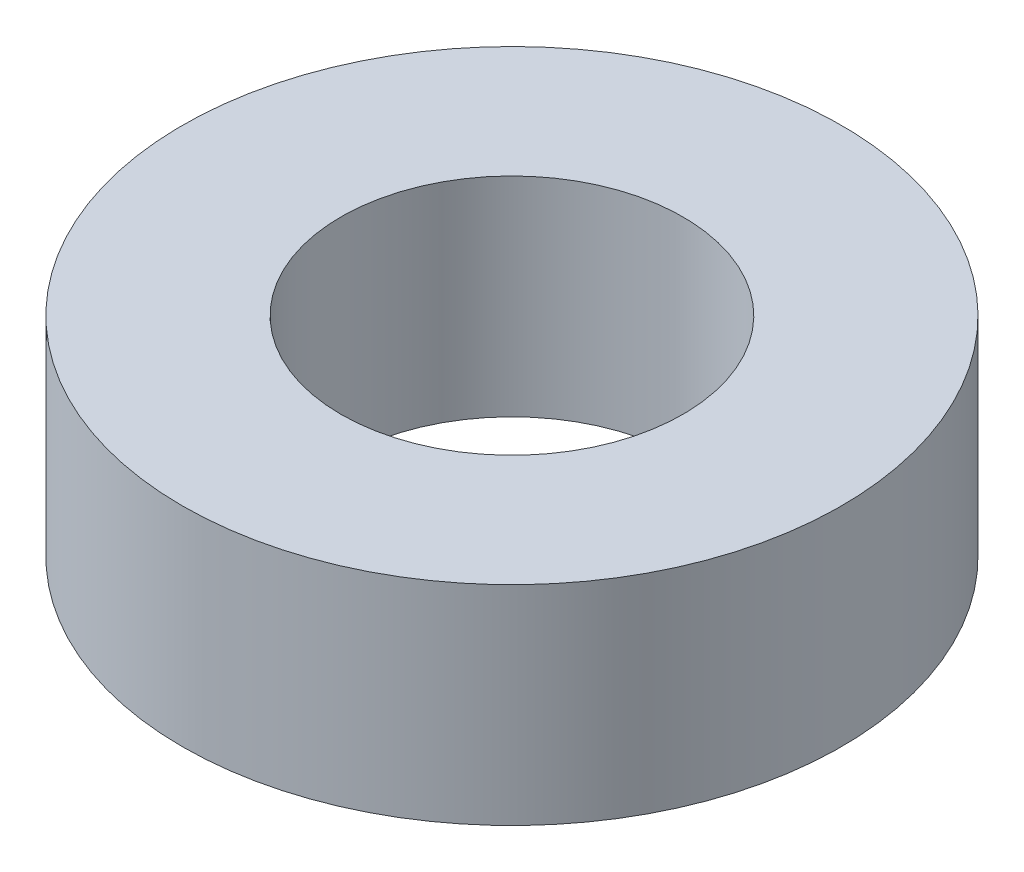
ISO-10303-21;
HEADER;
FILE_DESCRIPTION(('STEP AP214'),'2;1');
FILE_NAME('part.step','',(''),(''),'','','');
FILE_SCHEMA(('AUTOMOTIVE_DESIGN { 1 0 10303 214 1 1 1 1 }'));
ENDSEC;
DATA;
#1=APPLICATION_CONTEXT('core data for automotive mechanical design processes');
#2=APPLICATION_PROTOCOL_DEFINITION('international standard','automotive_design',2000,#1);
#3=PRODUCT_CONTEXT('',#1,'mechanical');
#4=PRODUCT('Part','Part','',(#3));
#5=PRODUCT_RELATED_PRODUCT_CATEGORY('part','',(#4));
#6=PRODUCT_DEFINITION_FORMATION('','',#4);
#7=PRODUCT_DEFINITION_CONTEXT('part definition',#1,'design');
#8=PRODUCT_DEFINITION('design','',#6,#7);
#9=PRODUCT_DEFINITION_SHAPE('','',#8);
#10=(LENGTH_UNIT() NAMED_UNIT(*) SI_UNIT(.MILLI.,.METRE.));
#11=(NAMED_UNIT(*) PLANE_ANGLE_UNIT() SI_UNIT($,.RADIAN.));
#12=(NAMED_UNIT(*) SI_UNIT($,.STERADIAN.) SOLID_ANGLE_UNIT());
#13=UNCERTAINTY_MEASURE_WITH_UNIT(LENGTH_MEASURE(1.E-05),#10,'distance_accuracy_value','');
#14=(GEOMETRIC_REPRESENTATION_CONTEXT(3) GLOBAL_UNCERTAINTY_ASSIGNED_CONTEXT((#13)) GLOBAL_UNIT_ASSIGNED_CONTEXT((#10,
#11,#12)) REPRESENTATION_CONTEXT('',''));
#15=CARTESIAN_POINT('',(0.,0.,0.));
#16=DIRECTION('',(0.,0.,1.));
#17=DIRECTION('',(1.,0.,0.));
#18=AXIS2_PLACEMENT_3D('',#15,#16,#17);
#19=CARTESIAN_POINT('',(0.,5.,0.));
#20=DIRECTION('',(0.,1.,0.));
#21=DIRECTION('',(0.,0.,1.));
#22=AXIS2_PLACEMENT_3D('',#19,#20,#21);
#23=PLANE('',#22);
#24=CARTESIAN_POINT('',(0.,5.,0.));
#25=DIRECTION('',(0.,1.,0.));
#26=DIRECTION('',(0.,0.,1.));
#27=AXIS2_PLACEMENT_3D('',#24,#25,#26);
#28=CIRCLE('',#27,7.9);
#29=CARTESIAN_POINT('',(0.,5.,7.9));
#30=VERTEX_POINT('',#29);
#31=EDGE_CURVE('E10',#30,#30,#28,.T.);
#32=ORIENTED_EDGE('',*,*,#31,.T.);
#33=EDGE_LOOP('',(#32));
#34=FACE_BOUND('',#33,.T.);
#35=CARTESIAN_POINT('',(0.,5.,0.));
#36=DIRECTION('',(0.,1.,0.));
#37=DIRECTION('',(0.,0.,1.));
#38=AXIS2_PLACEMENT_3D('',#35,#36,#37);
#39=CIRCLE('',#38,4.1);
#40=CARTESIAN_POINT('',(0.,5.,4.1));
#41=VERTEX_POINT('',#40);
#42=EDGE_CURVE('E42',#41,#41,#39,.T.);
#43=ORIENTED_EDGE('',*,*,#42,.F.);
#44=EDGE_LOOP('',(#43));
#45=FACE_BOUND('',#44,.T.);
#46=ADVANCED_FACE('F31',(#34,#45),#23,.T.);
#47=CARTESIAN_POINT('',(0.,0.,0.));
#48=DIRECTION('',(0.,1.,0.));
#49=DIRECTION('',(0.,0.,1.));
#50=AXIS2_PLACEMENT_3D('',#47,#48,#49);
#51=PLANE('',#50);
#52=CARTESIAN_POINT('',(0.,0.,0.));
#53=DIRECTION('',(0.,1.,0.));
#54=DIRECTION('',(0.,0.,1.));
#55=AXIS2_PLACEMENT_3D('',#52,#53,#54);
#56=CIRCLE('',#55,7.9);
#57=CARTESIAN_POINT('',(0.,0.,7.9));
#58=VERTEX_POINT('',#57);
#59=EDGE_CURVE('E35',#58,#58,#56,.T.);
#60=ORIENTED_EDGE('',*,*,#59,.F.);
#61=EDGE_LOOP('',(#60));
#62=FACE_BOUND('',#61,.T.);
#63=CARTESIAN_POINT('',(0.,0.,0.));
#64=DIRECTION('',(0.,1.,0.));
#65=DIRECTION('',(0.,0.,1.));
#66=AXIS2_PLACEMENT_3D('',#63,#64,#65);
#67=CIRCLE('',#66,4.1);
#68=CARTESIAN_POINT('',(0.,0.,4.1));
#69=VERTEX_POINT('',#68);
#70=EDGE_CURVE('E44',#69,#69,#67,.T.);
#71=ORIENTED_EDGE('',*,*,#70,.T.);
#72=EDGE_LOOP('',(#71));
#73=FACE_BOUND('',#72,.T.);
#74=ADVANCED_FACE('F54',(#62,#73),#51,.F.);
#75=CARTESIAN_POINT('',(0.,5.,0.));
#76=DIRECTION('',(0.,-1.,0.));
#77=DIRECTION('',(0.,0.,-1.));
#78=AXIS2_PLACEMENT_3D('',#75,#76,#77);
#79=CYLINDRICAL_SURFACE('',#78,7.9);
#80=ORIENTED_EDGE('',*,*,#31,.F.);
#81=EDGE_LOOP('',(#80));
#82=FACE_BOUND('',#81,.T.);
#83=ORIENTED_EDGE('',*,*,#59,.T.);
#84=EDGE_LOOP('',(#83));
#85=FACE_BOUND('',#84,.T.);
#86=ADVANCED_FACE('F33',(#82,#85),#79,.T.);
#87=CARTESIAN_POINT('',(0.,5.,0.));
#88=DIRECTION('',(0.,-1.,0.));
#89=DIRECTION('',(0.,0.,-1.));
#90=AXIS2_PLACEMENT_3D('',#87,#88,#89);
#91=CYLINDRICAL_SURFACE('',#90,4.1);
#92=ORIENTED_EDGE('',*,*,#42,.T.);
#93=EDGE_LOOP('',(#92));
#94=FACE_BOUND('',#93,.T.);
#95=ORIENTED_EDGE('',*,*,#70,.F.);
#96=EDGE_LOOP('',(#95));
#97=FACE_BOUND('',#96,.T.);
#98=ADVANCED_FACE('F50',(#94,#97),#91,.F.);
#99=CLOSED_SHELL('',(#46,#74,#86,#98));
#100=MANIFOLD_SOLID_BREP('B2',#99);
#101=ADVANCED_BREP_SHAPE_REPRESENTATION('',(#18,#100),#14);
#102=SHAPE_DEFINITION_REPRESENTATION(#9,#101);
ENDSEC;
END-ISO-10303-21;
